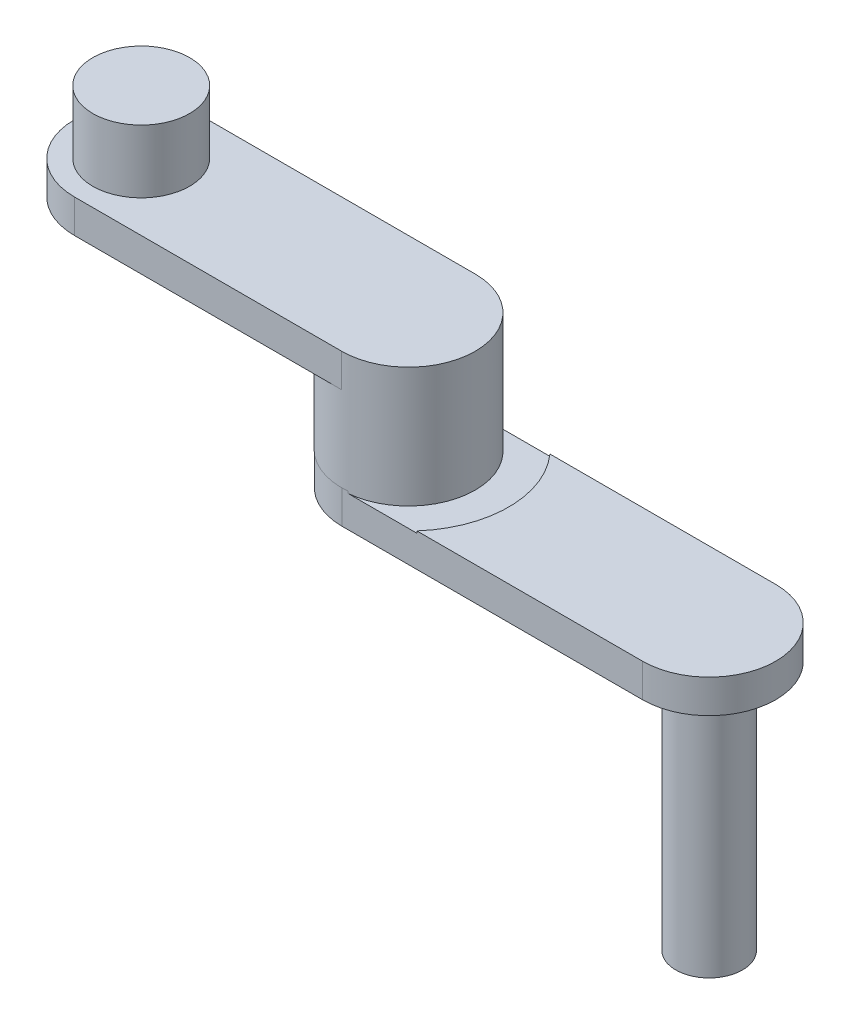
ISO-10303-21;
HEADER;
FILE_DESCRIPTION(('STEP AP214'),'2;1');
FILE_NAME('part.step','',(''),(''),'','','');
FILE_SCHEMA(('AUTOMOTIVE_DESIGN { 1 0 10303 214 1 1 1 1 }'));
ENDSEC;
DATA;
#1=APPLICATION_CONTEXT('core data for automotive mechanical design processes');
#2=APPLICATION_PROTOCOL_DEFINITION('international standard','automotive_design',2000,#1);
#3=PRODUCT_CONTEXT('',#1,'mechanical');
#4=PRODUCT('Part','Part','',(#3));
#5=PRODUCT_RELATED_PRODUCT_CATEGORY('part','',(#4));
#6=PRODUCT_DEFINITION_FORMATION('','',#4);
#7=PRODUCT_DEFINITION_CONTEXT('part definition',#1,'design');
#8=PRODUCT_DEFINITION('design','',#6,#7);
#9=PRODUCT_DEFINITION_SHAPE('','',#8);
#10=(LENGTH_UNIT() NAMED_UNIT(*) SI_UNIT(.MILLI.,.METRE.));
#11=(NAMED_UNIT(*) PLANE_ANGLE_UNIT() SI_UNIT($,.RADIAN.));
#12=(NAMED_UNIT(*) SI_UNIT($,.STERADIAN.) SOLID_ANGLE_UNIT());
#13=UNCERTAINTY_MEASURE_WITH_UNIT(LENGTH_MEASURE(1.E-05),#10,'distance_accuracy_value','');
#14=(GEOMETRIC_REPRESENTATION_CONTEXT(3) GLOBAL_UNCERTAINTY_ASSIGNED_CONTEXT((#13)) GLOBAL_UNIT_ASSIGNED_CONTEXT((#10,
#11,#12)) REPRESENTATION_CONTEXT('',''));
#15=CARTESIAN_POINT('',(0.,0.,0.));
#16=DIRECTION('',(0.,0.,1.));
#17=DIRECTION('',(1.,0.,0.));
#18=AXIS2_PLACEMENT_3D('',#15,#16,#17);
#19=CARTESIAN_POINT('',(0.,25.4,0.));
#20=DIRECTION('',(0.,1.,0.));
#21=DIRECTION('',(0.,0.,1.));
#22=AXIS2_PLACEMENT_3D('',#19,#20,#21);
#23=PLANE('',#22);
#24=CARTESIAN_POINT('',(-80.,25.4,0.));
#25=DIRECTION('',(0.,1.,0.));
#26=DIRECTION('',(0.,0.,1.));
#27=AXIS2_PLACEMENT_3D('',#24,#25,#26);
#28=CIRCLE('',#27,20.);
#29=CARTESIAN_POINT('',(-80.,25.4,-20.));
#30=VERTEX_POINT('',#29);
#31=CARTESIAN_POINT('',(-80.,25.4,20.));
#32=VERTEX_POINT('',#31);
#33=EDGE_CURVE('E202',#30,#32,#28,.T.);
#34=ORIENTED_EDGE('',*,*,#33,.F.);
#35=DIRECTION('',(-1.,0.,0.));
#36=VECTOR('',#35,1.);
#37=CARTESIAN_POINT('',(0.,25.4,-20.));
#38=LINE('',#37,#36);
#39=CARTESIAN_POINT('',(0.,25.4,-20.));
#40=VERTEX_POINT('',#39);
#41=EDGE_CURVE('E195',#40,#30,#38,.T.);
#42=ORIENTED_EDGE('',*,*,#41,.F.);
#43=CARTESIAN_POINT('',(0.,25.4,0.));
#44=DIRECTION('',(0.,1.,0.));
#45=DIRECTION('',(0.,0.,1.));
#46=AXIS2_PLACEMENT_3D('',#43,#44,#45);
#47=CIRCLE('',#46,20.);
#48=CARTESIAN_POINT('',(0.,25.4,20.));
#49=VERTEX_POINT('',#48);
#50=EDGE_CURVE('E287',#40,#49,#47,.T.);
#51=ORIENTED_EDGE('',*,*,#50,.T.);
#52=DIRECTION('',(1.,0.,0.));
#53=VECTOR('',#52,1.);
#54=CARTESIAN_POINT('',(0.,25.4,20.));
#55=LINE('',#54,#53);
#56=EDGE_CURVE('E212',#32,#49,#55,.T.);
#57=ORIENTED_EDGE('',*,*,#56,.F.);
#58=EDGE_LOOP('',(#34,#42,#51,#57));
#59=FACE_BOUND('',#58,.T.);
#60=ADVANCED_FACE('F37',(#59),#23,.F.);
#61=CARTESIAN_POINT('',(0.,35.4,0.));
#62=DIRECTION('',(0.,-1.,0.));
#63=DIRECTION('',(0.,0.,-1.));
#64=AXIS2_PLACEMENT_3D('',#61,#62,#63);
#65=CYLINDRICAL_SURFACE('',#64,20.);
#66=DIRECTION('',(0.,-1.,0.));
#67=VECTOR('',#66,1.);
#68=CARTESIAN_POINT('',(0.,35.4,20.));
#69=LINE('',#68,#67);
#70=CARTESIAN_POINT('',(0.,35.4,20.));
#71=VERTEX_POINT('',#70);
#72=EDGE_CURVE('E208',#71,#49,#69,.T.);
#73=ORIENTED_EDGE('',*,*,#72,.T.);
#74=ORIENTED_EDGE('',*,*,#50,.F.);
#75=DIRECTION('',(0.,-1.,0.));
#76=VECTOR('',#75,1.);
#77=CARTESIAN_POINT('',(0.,35.4,-20.));
#78=LINE('',#77,#76);
#79=CARTESIAN_POINT('',(0.,35.4,-20.));
#80=VERTEX_POINT('',#79);
#81=EDGE_CURVE('E224',#80,#40,#78,.T.);
#82=ORIENTED_EDGE('',*,*,#81,.F.);
#83=CARTESIAN_POINT('',(0.,35.4,0.));
#84=DIRECTION('',(0.,1.,0.));
#85=DIRECTION('',(0.,0.,1.));
#86=AXIS2_PLACEMENT_3D('',#83,#84,#85);
#87=CIRCLE('',#86,20.);
#88=EDGE_CURVE('E198',#71,#80,#87,.T.);
#89=ORIENTED_EDGE('',*,*,#88,.F.);
#90=EDGE_LOOP('',(#73,#74,#82,#89));
#91=FACE_BOUND('',#90,.T.);
#92=DIRECTION('',(0.,1.,0.));
#93=VECTOR('',#92,1.);
#94=CARTESIAN_POINT('',(1.78860830594236,-0.600000000000021,-19.9198614535321));
#95=LINE('',#94,#93);
#96=CARTESIAN_POINT('',(1.78860830594236,-0.600000000000021,-19.9198614535321));
#97=VERTEX_POINT('',#96);
#98=CARTESIAN_POINT('',(1.78860830594239,0.,-19.9198614535321));
#99=VERTEX_POINT('',#98);
#100=EDGE_CURVE('E154',#97,#99,#95,.T.);
#101=ORIENTED_EDGE('',*,*,#100,.T.);
#102=CARTESIAN_POINT('',(0.,0.,0.));
#103=DIRECTION('',(0.,1.,0.));
#104=DIRECTION('',(0.,0.,1.));
#105=AXIS2_PLACEMENT_3D('',#102,#103,#104);
#106=CIRCLE('',#105,20.);
#107=CARTESIAN_POINT('',(1.78860830594236,0.,19.9198614535321));
#108=VERTEX_POINT('',#107);
#109=EDGE_CURVE('E149',#99,#108,#106,.T.);
#110=ORIENTED_EDGE('',*,*,#109,.T.);
#111=DIRECTION('',(0.,1.,0.));
#112=VECTOR('',#111,1.);
#113=CARTESIAN_POINT('',(1.78860830594236,-0.600000000000021,19.9198614535321));
#114=LINE('',#113,#112);
#115=CARTESIAN_POINT('',(1.78860830594236,-0.600000000000021,19.9198614535321));
#116=VERTEX_POINT('',#115);
#117=EDGE_CURVE('E45',#108,#116,#114,.F.);
#118=ORIENTED_EDGE('',*,*,#117,.T.);
#119=CARTESIAN_POINT('',(0.,-0.600000000000021,0.));
#120=DIRECTION('',(0.,1.,0.));
#121=DIRECTION('',(0.,0.,1.));
#122=AXIS2_PLACEMENT_3D('',#119,#120,#121);
#123=CIRCLE('',#122,20.);
#124=EDGE_CURVE('E134',#116,#97,#123,.T.);
#125=ORIENTED_EDGE('',*,*,#124,.T.);
#126=EDGE_LOOP('',(#101,#110,#118,#125));
#127=FACE_BOUND('',#126,.T.);
#128=ADVANCED_FACE('F228',(#91,#127),#65,.T.);
#129=CARTESIAN_POINT('',(0.,35.4,-20.));
#130=DIRECTION('',(0.,0.,1.));
#131=DIRECTION('',(1.,0.,0.));
#132=AXIS2_PLACEMENT_3D('',#129,#130,#131);
#133=PLANE('',#132);
#134=ORIENTED_EDGE('',*,*,#41,.T.);
#135=DIRECTION('',(0.,-1.,0.));
#136=VECTOR('',#135,1.);
#137=CARTESIAN_POINT('',(-80.,35.4,-20.));
#138=LINE('',#137,#136);
#139=CARTESIAN_POINT('',(-80.,35.4,-20.));
#140=VERTEX_POINT('',#139);
#141=EDGE_CURVE('E221',#140,#30,#138,.T.);
#142=ORIENTED_EDGE('',*,*,#141,.F.);
#143=DIRECTION('',(-1.,0.,0.));
#144=VECTOR('',#143,1.);
#145=CARTESIAN_POINT('',(0.,35.4,-20.));
#146=LINE('',#145,#144);
#147=EDGE_CURVE('E201',#80,#140,#146,.T.);
#148=ORIENTED_EDGE('',*,*,#147,.F.);
#149=ORIENTED_EDGE('',*,*,#81,.T.);
#150=EDGE_LOOP('',(#134,#142,#148,#149));
#151=FACE_BOUND('',#150,.T.);
#152=ADVANCED_FACE('F263',(#151),#133,.F.);
#153=CARTESIAN_POINT('',(-80.,35.4,0.));
#154=DIRECTION('',(0.,-1.,0.));
#155=DIRECTION('',(0.,0.,-1.));
#156=AXIS2_PLACEMENT_3D('',#153,#154,#155);
#157=CYLINDRICAL_SURFACE('',#156,20.);
#158=ORIENTED_EDGE('',*,*,#33,.T.);
#159=DIRECTION('',(0.,-1.,0.));
#160=VECTOR('',#159,1.);
#161=CARTESIAN_POINT('',(-80.,35.4,20.));
#162=LINE('',#161,#160);
#163=CARTESIAN_POINT('',(-80.,35.4,20.));
#164=VERTEX_POINT('',#163);
#165=EDGE_CURVE('E218',#164,#32,#162,.T.);
#166=ORIENTED_EDGE('',*,*,#165,.F.);
#167=CARTESIAN_POINT('',(-80.,35.4,0.));
#168=DIRECTION('',(0.,1.,0.));
#169=DIRECTION('',(0.,0.,1.));
#170=AXIS2_PLACEMENT_3D('',#167,#168,#169);
#171=CIRCLE('',#170,20.);
#172=EDGE_CURVE('E204',#140,#164,#171,.T.);
#173=ORIENTED_EDGE('',*,*,#172,.F.);
#174=ORIENTED_EDGE('',*,*,#141,.T.);
#175=EDGE_LOOP('',(#158,#166,#173,#174));
#176=FACE_BOUND('',#175,.T.);
#177=ADVANCED_FACE('F273',(#176),#157,.T.);
#178=CARTESIAN_POINT('',(0.,35.4,20.));
#179=DIRECTION('',(0.,0.,-1.));
#180=DIRECTION('',(-1.,0.,0.));
#181=AXIS2_PLACEMENT_3D('',#178,#179,#180);
#182=PLANE('',#181);
#183=ORIENTED_EDGE('',*,*,#165,.T.);
#184=ORIENTED_EDGE('',*,*,#56,.T.);
#185=ORIENTED_EDGE('',*,*,#72,.F.);
#186=DIRECTION('',(1.,0.,0.));
#187=VECTOR('',#186,1.);
#188=CARTESIAN_POINT('',(0.,35.4,20.));
#189=LINE('',#188,#187);
#190=EDGE_CURVE('E206',#164,#71,#189,.T.);
#191=ORIENTED_EDGE('',*,*,#190,.F.);
#192=EDGE_LOOP('',(#183,#184,#185,#191));
#193=FACE_BOUND('',#192,.T.);
#194=ADVANCED_FACE('F270',(#193),#182,.F.);
#195=CARTESIAN_POINT('',(0.,35.4,0.));
#196=DIRECTION('',(0.,1.,0.));
#197=DIRECTION('',(0.,0.,1.));
#198=AXIS2_PLACEMENT_3D('',#195,#196,#197);
#199=PLANE('',#198);
#200=CARTESIAN_POINT('',(-80.,35.4,0.));
#201=DIRECTION('',(0.,1.,0.));
#202=DIRECTION('',(0.,0.,1.));
#203=AXIS2_PLACEMENT_3D('',#200,#201,#202);
#204=CIRCLE('',#203,14.5);
#205=CARTESIAN_POINT('',(-80.,35.4,14.5));
#206=VERTEX_POINT('',#205);
#207=EDGE_CURVE('E191',#206,#206,#204,.T.);
#208=ORIENTED_EDGE('',*,*,#207,.F.);
#209=EDGE_LOOP('',(#208));
#210=FACE_BOUND('',#209,.T.);
#211=ORIENTED_EDGE('',*,*,#88,.T.);
#212=ORIENTED_EDGE('',*,*,#147,.T.);
#213=ORIENTED_EDGE('',*,*,#172,.T.);
#214=ORIENTED_EDGE('',*,*,#190,.T.);
#215=EDGE_LOOP('',(#211,#212,#213,#214));
#216=FACE_BOUND('',#215,.T.);
#217=ADVANCED_FACE('F268',(#210,#216),#199,.T.);
#218=CARTESIAN_POINT('',(-80.,54.2647792194698,0.));
#219=DIRECTION('',(0.,-1.,0.));
#220=DIRECTION('',(0.,0.,-1.));
#221=AXIS2_PLACEMENT_3D('',#218,#219,#220);
#222=CYLINDRICAL_SURFACE('',#221,14.5);
#223=CARTESIAN_POINT('',(-80.,54.2647792194698,0.));
#224=DIRECTION('',(0.,1.,0.));
#225=DIRECTION('',(0.,0.,1.));
#226=AXIS2_PLACEMENT_3D('',#223,#224,#225);
#227=CIRCLE('',#226,14.5);
#228=CARTESIAN_POINT('',(-80.,54.2647792194698,14.5));
#229=VERTEX_POINT('',#228);
#230=EDGE_CURVE('E192',#229,#229,#227,.T.);
#231=ORIENTED_EDGE('',*,*,#230,.F.);
#232=EDGE_LOOP('',(#231));
#233=FACE_BOUND('',#232,.T.);
#234=ORIENTED_EDGE('',*,*,#207,.T.);
#235=EDGE_LOOP('',(#234));
#236=FACE_BOUND('',#235,.T.);
#237=ADVANCED_FACE('F293',(#233,#236),#222,.T.);
#238=CARTESIAN_POINT('',(-80.,54.2647792194698,0.));
#239=DIRECTION('',(0.,1.,0.));
#240=DIRECTION('',(0.,0.,1.));
#241=AXIS2_PLACEMENT_3D('',#238,#239,#240);
#242=PLANE('',#241);
#243=ORIENTED_EDGE('',*,*,#230,.T.);
#244=EDGE_LOOP('',(#243));
#245=FACE_BOUND('',#244,.T.);
#246=ADVANCED_FACE('F298',(#245),#242,.T.);
#247=CARTESIAN_POINT('',(0.,-0.600000000000021,0.));
#248=DIRECTION('',(0.,1.,0.));
#249=DIRECTION('',(0.,0.,1.));
#250=AXIS2_PLACEMENT_3D('',#247,#248,#249);
#251=PLANE('',#250);
#252=DIRECTION('',(-1.,0.,0.));
#253=VECTOR('',#252,1.);
#254=CARTESIAN_POINT('',(0.,-0.600000000000021,-19.9198614535321));
#255=LINE('',#254,#253);
#256=CARTESIAN_POINT('',(22.4321002064471,-0.600000000000021,-19.9198614535321));
#257=VERTEX_POINT('',#256);
#258=EDGE_CURVE('E156',#257,#97,#255,.T.);
#259=ORIENTED_EDGE('',*,*,#258,.T.);
#260=ORIENTED_EDGE('',*,*,#124,.F.);
#261=DIRECTION('',(1.,0.,0.));
#262=VECTOR('',#261,1.);
#263=CARTESIAN_POINT('',(0.,-0.600000000000021,19.9198614535321));
#264=LINE('',#263,#262);
#265=CARTESIAN_POINT('',(22.4321002064471,-0.600000000000021,19.9198614535321));
#266=VERTEX_POINT('',#265);
#267=EDGE_CURVE('E11',#116,#266,#264,.T.);
#268=ORIENTED_EDGE('',*,*,#267,.T.);
#269=CARTESIAN_POINT('',(0.,-0.600000000000021,0.));
#270=DIRECTION('',(0.,1.,0.));
#271=DIRECTION('',(0.,0.,1.));
#272=AXIS2_PLACEMENT_3D('',#269,#270,#271);
#273=CIRCLE('',#272,30.);
#274=EDGE_CURVE('E131',#266,#257,#273,.T.);
#275=ORIENTED_EDGE('',*,*,#274,.T.);
#276=EDGE_LOOP('',(#259,#260,#268,#275));
#277=FACE_BOUND('',#276,.T.);
#278=ADVANCED_FACE('F130',(#277),#251,.T.);
#279=CARTESIAN_POINT('',(0.,-0.600000000000021,0.));
#280=DIRECTION('',(0.,1.,0.));
#281=DIRECTION('',(0.,0.,1.));
#282=AXIS2_PLACEMENT_3D('',#279,#280,#281);
#283=CYLINDRICAL_SURFACE('',#282,30.);
#284=ORIENTED_EDGE('',*,*,#274,.F.);
#285=DIRECTION('',(0.,1.,0.));
#286=VECTOR('',#285,1.);
#287=CARTESIAN_POINT('',(22.4321002064471,-0.600000000000021,19.9198614535321));
#288=LINE('',#287,#286);
#289=CARTESIAN_POINT('',(22.4321002064471,0.,19.9198614535321));
#290=VERTEX_POINT('',#289);
#291=EDGE_CURVE('E138',#290,#266,#288,.F.);
#292=ORIENTED_EDGE('',*,*,#291,.F.);
#293=CARTESIAN_POINT('',(0.,0.,0.));
#294=DIRECTION('',(0.,1.,0.));
#295=DIRECTION('',(0.,0.,1.));
#296=AXIS2_PLACEMENT_3D('',#293,#294,#295);
#297=CIRCLE('',#296,30.);
#298=CARTESIAN_POINT('',(22.4321002064471,0.,-19.9198614535321));
#299=VERTEX_POINT('',#298);
#300=EDGE_CURVE('E215',#290,#299,#297,.T.);
#301=ORIENTED_EDGE('',*,*,#300,.T.);
#302=DIRECTION('',(0.,1.,0.));
#303=VECTOR('',#302,1.);
#304=CARTESIAN_POINT('',(22.4321002064471,-0.600000000000021,-19.9198614535321));
#305=LINE('',#304,#303);
#306=EDGE_CURVE('E141',#257,#299,#305,.T.);
#307=ORIENTED_EDGE('',*,*,#306,.F.);
#308=EDGE_LOOP('',(#284,#292,#301,#307));
#309=FACE_BOUND('',#308,.T.);
#310=ADVANCED_FACE('F137',(#309),#283,.F.);
#311=CARTESIAN_POINT('',(90.,-85.,0.));
#312=DIRECTION('',(0.,-1.,0.));
#313=DIRECTION('',(0.,0.,-1.));
#314=AXIS2_PLACEMENT_3D('',#311,#312,#313);
#315=PLANE('',#314);
#316=CARTESIAN_POINT('',(90.,-85.,0.));
#317=DIRECTION('',(0.,-1.,0.));
#318=DIRECTION('',(0.,0.,-1.));
#319=AXIS2_PLACEMENT_3D('',#316,#317,#318);
#320=CIRCLE('',#319,9.99999999999999);
#321=CARTESIAN_POINT('',(90.,-85.,-9.99999999999998));
#322=VERTEX_POINT('',#321);
#323=EDGE_CURVE('E159',#322,#322,#320,.T.);
#324=ORIENTED_EDGE('',*,*,#323,.T.);
#325=EDGE_LOOP('',(#324));
#326=FACE_BOUND('',#325,.T.);
#327=ADVANCED_FACE('F319',(#326),#315,.T.);
#328=CARTESIAN_POINT('',(90.,-85.,0.));
#329=DIRECTION('',(0.,1.,0.));
#330=DIRECTION('',(0.,0.,1.));
#331=AXIS2_PLACEMENT_3D('',#328,#329,#330);
#332=CYLINDRICAL_SURFACE('',#331,9.99999999999999);
#333=ORIENTED_EDGE('',*,*,#323,.F.);
#334=EDGE_LOOP('',(#333));
#335=FACE_BOUND('',#334,.T.);
#336=CARTESIAN_POINT('',(90.,-10.,0.));
#337=DIRECTION('',(0.,-1.,0.));
#338=DIRECTION('',(0.,0.,-1.));
#339=AXIS2_PLACEMENT_3D('',#336,#337,#338);
#340=CIRCLE('',#339,9.99999999999999);
#341=CARTESIAN_POINT('',(90.,-10.,-9.99999999999998));
#342=VERTEX_POINT('',#341);
#343=EDGE_CURVE('E158',#342,#342,#340,.T.);
#344=ORIENTED_EDGE('',*,*,#343,.T.);
#345=EDGE_LOOP('',(#344));
#346=FACE_BOUND('',#345,.T.);
#347=ADVANCED_FACE('F313',(#335,#346),#332,.T.);
#348=CARTESIAN_POINT('',(0.,-10.,0.));
#349=DIRECTION('',(0.,-1.,0.));
#350=DIRECTION('',(0.,0.,-1.));
#351=AXIS2_PLACEMENT_3D('',#348,#349,#350);
#352=PLANE('',#351);
#353=ORIENTED_EDGE('',*,*,#343,.F.);
#354=EDGE_LOOP('',(#353));
#355=FACE_BOUND('',#354,.T.);
#356=CARTESIAN_POINT('',(0.,-10.,0.));
#357=DIRECTION('',(0.,-1.,0.));
#358=DIRECTION('',(0.,0.,-1.));
#359=AXIS2_PLACEMENT_3D('',#356,#357,#358);
#360=CIRCLE('',#359,19.9198614535321);
#361=CARTESIAN_POINT('',(0.,-10.,19.9198614535321));
#362=VERTEX_POINT('',#361);
#363=CARTESIAN_POINT('',(0.,-10.,-19.9198614535321));
#364=VERTEX_POINT('',#363);
#365=EDGE_CURVE('E165',#362,#364,#360,.T.);
#366=ORIENTED_EDGE('',*,*,#365,.T.);
#367=DIRECTION('',(1.,0.,0.));
#368=VECTOR('',#367,1.);
#369=CARTESIAN_POINT('',(0.,-10.,-19.9198614535321));
#370=LINE('',#369,#368);
#371=CARTESIAN_POINT('',(90.,-10.,-19.9198614535321));
#372=VERTEX_POINT('',#371);
#373=EDGE_CURVE('E168',#364,#372,#370,.T.);
#374=ORIENTED_EDGE('',*,*,#373,.T.);
#375=CARTESIAN_POINT('',(90.,-10.,0.));
#376=DIRECTION('',(0.,-1.,0.));
#377=DIRECTION('',(0.,0.,-1.));
#378=AXIS2_PLACEMENT_3D('',#375,#376,#377);
#379=CIRCLE('',#378,19.9198614535321);
#380=CARTESIAN_POINT('',(90.,-10.,19.9198614535321));
#381=VERTEX_POINT('',#380);
#382=EDGE_CURVE('E170',#372,#381,#379,.T.);
#383=ORIENTED_EDGE('',*,*,#382,.T.);
#384=DIRECTION('',(-1.,0.,0.));
#385=VECTOR('',#384,1.);
#386=CARTESIAN_POINT('',(0.,-10.,19.9198614535321));
#387=LINE('',#386,#385);
#388=EDGE_CURVE('E172',#381,#362,#387,.T.);
#389=ORIENTED_EDGE('',*,*,#388,.T.);
#390=EDGE_LOOP('',(#366,#374,#383,#389));
#391=FACE_BOUND('',#390,.T.);
#392=ADVANCED_FACE('F237',(#355,#391),#352,.T.);
#393=CARTESIAN_POINT('',(0.,-10.,0.));
#394=DIRECTION('',(0.,1.,0.));
#395=DIRECTION('',(0.,0.,1.));
#396=AXIS2_PLACEMENT_3D('',#393,#394,#395);
#397=CYLINDRICAL_SURFACE('',#396,19.9198614535321);
#398=CARTESIAN_POINT('',(0.,0.,0.));
#399=DIRECTION('',(0.,-1.,0.));
#400=DIRECTION('',(0.,0.,-1.));
#401=AXIS2_PLACEMENT_3D('',#398,#399,#400);
#402=CIRCLE('',#401,19.9198614535321);
#403=CARTESIAN_POINT('',(0.,0.,19.9198614535321));
#404=VERTEX_POINT('',#403);
#405=CARTESIAN_POINT('',(0.,0.,-19.9198614535321));
#406=VERTEX_POINT('',#405);
#407=EDGE_CURVE('E162',#404,#406,#402,.T.);
#408=ORIENTED_EDGE('',*,*,#407,.T.);
#409=DIRECTION('',(0.,1.,0.));
#410=VECTOR('',#409,1.);
#411=CARTESIAN_POINT('',(0.,-10.,-19.9198614535321));
#412=LINE('',#411,#410);
#413=EDGE_CURVE('E189',#364,#406,#412,.T.);
#414=ORIENTED_EDGE('',*,*,#413,.F.);
#415=ORIENTED_EDGE('',*,*,#365,.F.);
#416=DIRECTION('',(0.,1.,0.));
#417=VECTOR('',#416,1.);
#418=CARTESIAN_POINT('',(0.,-10.,19.9198614535321));
#419=LINE('',#418,#417);
#420=EDGE_CURVE('E174',#362,#404,#419,.T.);
#421=ORIENTED_EDGE('',*,*,#420,.T.);
#422=EDGE_LOOP('',(#408,#414,#415,#421));
#423=FACE_BOUND('',#422,.T.);
#424=ADVANCED_FACE('F233',(#423),#397,.T.);
#425=CARTESIAN_POINT('',(90.,-10.,0.));
#426=DIRECTION('',(0.,1.,0.));
#427=DIRECTION('',(0.,0.,1.));
#428=AXIS2_PLACEMENT_3D('',#425,#426,#427);
#429=CYLINDRICAL_SURFACE('',#428,19.9198614535321);
#430=CARTESIAN_POINT('',(90.,0.,0.));
#431=DIRECTION('',(0.,-1.,0.));
#432=DIRECTION('',(0.,0.,-1.));
#433=AXIS2_PLACEMENT_3D('',#430,#431,#432);
#434=CIRCLE('',#433,19.9198614535321);
#435=CARTESIAN_POINT('',(90.,0.,-19.9198614535321));
#436=VERTEX_POINT('',#435);
#437=CARTESIAN_POINT('',(90.,0.,19.9198614535321));
#438=VERTEX_POINT('',#437);
#439=EDGE_CURVE('E179',#436,#438,#434,.T.);
#440=ORIENTED_EDGE('',*,*,#439,.T.);
#441=DIRECTION('',(0.,1.,0.));
#442=VECTOR('',#441,1.);
#443=CARTESIAN_POINT('',(90.,-10.,19.9198614535321));
#444=LINE('',#443,#442);
#445=EDGE_CURVE('E184',#381,#438,#444,.T.);
#446=ORIENTED_EDGE('',*,*,#445,.F.);
#447=ORIENTED_EDGE('',*,*,#382,.F.);
#448=DIRECTION('',(0.,1.,0.));
#449=VECTOR('',#448,1.);
#450=CARTESIAN_POINT('',(90.,-10.,-19.9198614535321));
#451=LINE('',#450,#449);
#452=EDGE_CURVE('E186',#372,#436,#451,.T.);
#453=ORIENTED_EDGE('',*,*,#452,.T.);
#454=EDGE_LOOP('',(#440,#446,#447,#453));
#455=FACE_BOUND('',#454,.T.);
#456=ADVANCED_FACE('F241',(#455),#429,.T.);
#457=CARTESIAN_POINT('',(0.,0.,0.));
#458=DIRECTION('',(0.,-1.,0.));
#459=DIRECTION('',(0.,0.,-1.));
#460=AXIS2_PLACEMENT_3D('',#457,#458,#459);
#461=PLANE('',#460);
#462=ORIENTED_EDGE('',*,*,#300,.F.);
#463=DIRECTION('',(-1.,0.,0.));
#464=VECTOR('',#463,1.);
#465=CARTESIAN_POINT('',(0.,0.,19.9198614535321));
#466=LINE('',#465,#464);
#467=EDGE_CURVE('E147',#438,#290,#466,.T.);
#468=ORIENTED_EDGE('',*,*,#467,.F.);
#469=ORIENTED_EDGE('',*,*,#439,.F.);
#470=DIRECTION('',(1.,0.,0.));
#471=VECTOR('',#470,1.);
#472=CARTESIAN_POINT('',(0.,0.,-19.9198614535321));
#473=LINE('',#472,#471);
#474=EDGE_CURVE('E177',#299,#436,#473,.T.);
#475=ORIENTED_EDGE('',*,*,#474,.F.);
#476=EDGE_LOOP('',(#462,#468,#469,#475));
#477=FACE_BOUND('',#476,.T.);
#478=ADVANCED_FACE('F245',(#477),#461,.F.);
#479=CARTESIAN_POINT('',(0.,-10.,19.9198614535321));
#480=DIRECTION('',(0.,0.,-1.));
#481=DIRECTION('',(-1.,0.,0.));
#482=AXIS2_PLACEMENT_3D('',#479,#480,#481);
#483=PLANE('',#482);
#484=ORIENTED_EDGE('',*,*,#467,.T.);
#485=ORIENTED_EDGE('',*,*,#291,.T.);
#486=ORIENTED_EDGE('',*,*,#267,.F.);
#487=ORIENTED_EDGE('',*,*,#117,.F.);
#488=EDGE_CURVE('E52',#108,#404,#466,.T.);
#489=ORIENTED_EDGE('',*,*,#488,.T.);
#490=ORIENTED_EDGE('',*,*,#420,.F.);
#491=ORIENTED_EDGE('',*,*,#388,.F.);
#492=ORIENTED_EDGE('',*,*,#445,.T.);
#493=EDGE_LOOP('',(#484,#485,#486,#487,#489,#490,#491,#492));
#494=FACE_BOUND('',#493,.T.);
#495=ADVANCED_FACE('F144',(#494),#483,.F.);
#496=CARTESIAN_POINT('',(0.,-10.,-19.9198614535321));
#497=DIRECTION('',(0.,0.,1.));
#498=DIRECTION('',(1.,0.,0.));
#499=AXIS2_PLACEMENT_3D('',#496,#497,#498);
#500=PLANE('',#499);
#501=ORIENTED_EDGE('',*,*,#258,.F.);
#502=ORIENTED_EDGE('',*,*,#306,.T.);
#503=ORIENTED_EDGE('',*,*,#474,.T.);
#504=ORIENTED_EDGE('',*,*,#452,.F.);
#505=ORIENTED_EDGE('',*,*,#373,.F.);
#506=ORIENTED_EDGE('',*,*,#413,.T.);
#507=EDGE_CURVE('E59',#406,#99,#473,.T.);
#508=ORIENTED_EDGE('',*,*,#507,.T.);
#509=ORIENTED_EDGE('',*,*,#100,.F.);
#510=EDGE_LOOP('',(#501,#502,#503,#504,#505,#506,#508,#509));
#511=FACE_BOUND('',#510,.T.);
#512=ADVANCED_FACE('F247',(#511),#500,.F.);
#513=CARTESIAN_POINT('',(0.,0.,0.));
#514=DIRECTION('',(0.,1.,0.));
#515=DIRECTION('',(0.,0.,1.));
#516=AXIS2_PLACEMENT_3D('',#513,#514,#515);
#517=PLANE('',#516);
#518=ORIENTED_EDGE('',*,*,#109,.F.);
#519=ORIENTED_EDGE('',*,*,#507,.F.);
#520=ORIENTED_EDGE('',*,*,#407,.F.);
#521=ORIENTED_EDGE('',*,*,#488,.F.);
#522=EDGE_LOOP('',(#518,#519,#520,#521));
#523=FACE_BOUND('',#522,.T.);
#524=ADVANCED_FACE('F39',(#523),#517,.F.);
#525=CLOSED_SHELL('',(#60,#128,#152,#177,#194,#217,#237,#246,#278,#310,#327,#347,#392,#424,#456,
#478,#495,#512,#524));
#526=MANIFOLD_SOLID_BREP('B2',#525);
#527=ADVANCED_BREP_SHAPE_REPRESENTATION('',(#18,#526),#14);
#528=SHAPE_DEFINITION_REPRESENTATION(#9,#527);
ENDSEC;
END-ISO-10303-21;
